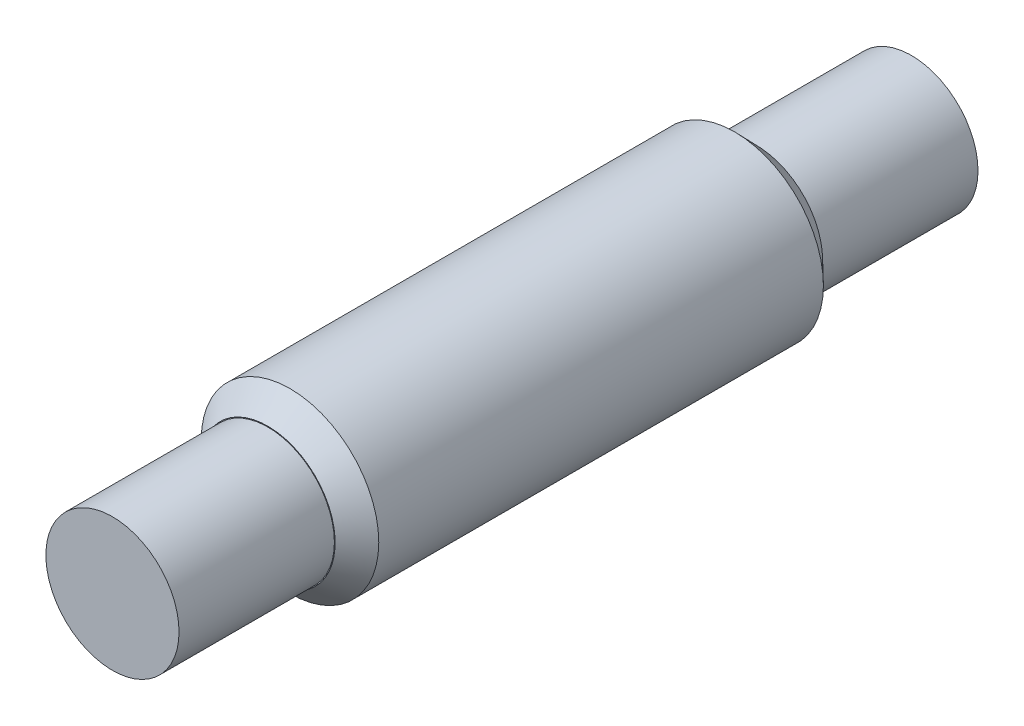
ISO-10303-21;
HEADER;
FILE_DESCRIPTION(('STEP AP214'),'2;1');
FILE_NAME('part.step','',(''),(''),'','','');
FILE_SCHEMA(('AUTOMOTIVE_DESIGN { 1 0 10303 214 1 1 1 1 }'));
ENDSEC;
DATA;
#1=APPLICATION_CONTEXT('core data for automotive mechanical design processes');
#2=APPLICATION_PROTOCOL_DEFINITION('international standard','automotive_design',2000,#1);
#3=PRODUCT_CONTEXT('',#1,'mechanical');
#4=PRODUCT('Part','Part','',(#3));
#5=PRODUCT_RELATED_PRODUCT_CATEGORY('part','',(#4));
#6=PRODUCT_DEFINITION_FORMATION('','',#4);
#7=PRODUCT_DEFINITION_CONTEXT('part definition',#1,'design');
#8=PRODUCT_DEFINITION('design','',#6,#7);
#9=PRODUCT_DEFINITION_SHAPE('','',#8);
#10=(LENGTH_UNIT() NAMED_UNIT(*) SI_UNIT(.MILLI.,.METRE.));
#11=(NAMED_UNIT(*) PLANE_ANGLE_UNIT() SI_UNIT($,.RADIAN.));
#12=(NAMED_UNIT(*) SI_UNIT($,.STERADIAN.) SOLID_ANGLE_UNIT());
#13=UNCERTAINTY_MEASURE_WITH_UNIT(LENGTH_MEASURE(1.E-05),#10,'distance_accuracy_value','');
#14=(GEOMETRIC_REPRESENTATION_CONTEXT(3) GLOBAL_UNCERTAINTY_ASSIGNED_CONTEXT((#13)) GLOBAL_UNIT_ASSIGNED_CONTEXT((#10,
#11,#12)) REPRESENTATION_CONTEXT('',''));
#15=CARTESIAN_POINT('',(0.,0.,0.));
#16=DIRECTION('',(0.,0.,1.));
#17=DIRECTION('',(1.,0.,0.));
#18=AXIS2_PLACEMENT_3D('',#15,#16,#17);
#19=CARTESIAN_POINT('',(0.,0.,9.));
#20=DIRECTION('',(0.,0.,-1.));
#21=DIRECTION('',(-1.,0.,0.));
#22=AXIS2_PLACEMENT_3D('',#19,#20,#21);
#23=PLANE('',#22);
#24=CARTESIAN_POINT('',(0.,0.,9.));
#25=DIRECTION('',(0.,0.,1.));
#26=DIRECTION('',(1.,0.,0.));
#27=AXIS2_PLACEMENT_3D('',#24,#25,#26);
#28=CIRCLE('',#27,1.5);
#29=CARTESIAN_POINT('',(1.5,0.,9.));
#30=VERTEX_POINT('',#29);
#31=EDGE_CURVE('E53',#30,#30,#28,.T.);
#32=ORIENTED_EDGE('',*,*,#31,.T.);
#33=EDGE_LOOP('',(#32));
#34=FACE_BOUND('',#33,.T.);
#35=ADVANCED_FACE('F37',(#34),#23,.F.);
#36=CARTESIAN_POINT('',(0.,0.,9.));
#37=DIRECTION('',(0.,0.,1.));
#38=DIRECTION('',(1.,0.,0.));
#39=AXIS2_PLACEMENT_3D('',#36,#37,#38);
#40=CYLINDRICAL_SURFACE('',#39,1.5);
#41=ORIENTED_EDGE('',*,*,#31,.F.);
#42=EDGE_LOOP('',(#41));
#43=FACE_BOUND('',#42,.T.);
#44=CARTESIAN_POINT('',(0.,0.,5.5));
#45=DIRECTION('',(0.,0.,1.));
#46=DIRECTION('',(1.,0.,0.));
#47=AXIS2_PLACEMENT_3D('',#44,#45,#46);
#48=CIRCLE('',#47,1.5);
#49=CARTESIAN_POINT('',(1.5,0.,5.5));
#50=VERTEX_POINT('',#49);
#51=EDGE_CURVE('E58',#50,#50,#48,.T.);
#52=ORIENTED_EDGE('',*,*,#51,.T.);
#53=EDGE_LOOP('',(#52));
#54=FACE_BOUND('',#53,.T.);
#55=ADVANCED_FACE('F83',(#43,#54),#40,.T.);
#56=CARTESIAN_POINT('',(0.,1.5,5.5));
#57=DIRECTION('',(0.,0.,-1.));
#58=DIRECTION('',(-1.,0.,0.));
#59=AXIS2_PLACEMENT_3D('',#56,#57,#58);
#60=PLANE('',#59);
#61=CARTESIAN_POINT('',(0.,0.,5.5));
#62=DIRECTION('',(0.,0.,-1.));
#63=DIRECTION('',(-1.,0.,0.));
#64=AXIS2_PLACEMENT_3D('',#61,#62,#63);
#65=CIRCLE('',#64,1.51715561259646);
#66=CARTESIAN_POINT('',(-1.51715561259646,0.,5.5));
#67=VERTEX_POINT('',#66);
#68=EDGE_CURVE('E10',#67,#67,#65,.F.);
#69=ORIENTED_EDGE('',*,*,#68,.T.);
#70=EDGE_LOOP('',(#69));
#71=FACE_BOUND('',#70,.T.);
#72=ORIENTED_EDGE('',*,*,#51,.F.);
#73=EDGE_LOOP('',(#72));
#74=FACE_BOUND('',#73,.T.);
#75=ADVANCED_FACE('F89',(#71,#74),#60,.F.);
#76=CARTESIAN_POINT('',(0.,0.,9.));
#77=DIRECTION('',(0.,0.,1.));
#78=DIRECTION('',(1.,0.,0.));
#79=AXIS2_PLACEMENT_3D('',#76,#77,#78);
#80=CYLINDRICAL_SURFACE('',#79,2.);
#81=CARTESIAN_POINT('',(0.,0.,-5.01715561259646));
#82=DIRECTION('',(0.,0.,1.));
#83=DIRECTION('',(1.,0.,0.));
#84=AXIS2_PLACEMENT_3D('',#81,#82,#83);
#85=CIRCLE('',#84,2.);
#86=CARTESIAN_POINT('',(2.,0.,-5.01715561259646));
#87=VERTEX_POINT('',#86);
#88=EDGE_CURVE('E45',#87,#87,#85,.T.);
#89=ORIENTED_EDGE('',*,*,#88,.T.);
#90=EDGE_LOOP('',(#89));
#91=FACE_BOUND('',#90,.T.);
#92=CARTESIAN_POINT('',(0.,0.,5.));
#93=DIRECTION('',(0.,0.,-1.));
#94=DIRECTION('',(-1.,0.,0.));
#95=AXIS2_PLACEMENT_3D('',#92,#93,#94);
#96=CIRCLE('',#95,2.);
#97=CARTESIAN_POINT('',(-2.,0.,5.));
#98=VERTEX_POINT('',#97);
#99=EDGE_CURVE('E49',#98,#98,#96,.T.);
#100=ORIENTED_EDGE('',*,*,#99,.T.);
#101=EDGE_LOOP('',(#100));
#102=FACE_BOUND('',#101,.T.);
#103=ADVANCED_FACE('F79',(#91,#102),#80,.T.);
#104=CARTESIAN_POINT('',(0.,0.,9.));
#105=DIRECTION('',(0.,0.,1.));
#106=DIRECTION('',(1.,0.,0.));
#107=AXIS2_PLACEMENT_3D('',#104,#105,#106);
#108=CYLINDRICAL_SURFACE('',#107,1.5);
#109=CARTESIAN_POINT('',(0.,0.,-5.5));
#110=DIRECTION('',(0.,0.,1.));
#111=DIRECTION('',(1.,0.,0.));
#112=AXIS2_PLACEMENT_3D('',#109,#110,#111);
#113=CIRCLE('',#112,1.5);
#114=CARTESIAN_POINT('',(1.5,0.,-5.5));
#115=VERTEX_POINT('',#114);
#116=EDGE_CURVE('E61',#115,#115,#113,.T.);
#117=ORIENTED_EDGE('',*,*,#116,.F.);
#118=EDGE_LOOP('',(#117));
#119=FACE_BOUND('',#118,.T.);
#120=CARTESIAN_POINT('',(0.,0.,-9.));
#121=DIRECTION('',(0.,0.,1.));
#122=DIRECTION('',(1.,0.,0.));
#123=AXIS2_PLACEMENT_3D('',#120,#121,#122);
#124=CIRCLE('',#123,1.5);
#125=CARTESIAN_POINT('',(1.5,0.,-9.));
#126=VERTEX_POINT('',#125);
#127=EDGE_CURVE('E64',#126,#126,#124,.T.);
#128=ORIENTED_EDGE('',*,*,#127,.T.);
#129=EDGE_LOOP('',(#128));
#130=FACE_BOUND('',#129,.T.);
#131=ADVANCED_FACE('F68',(#119,#130),#108,.T.);
#132=CARTESIAN_POINT('',(0.,0.,-9.));
#133=DIRECTION('',(0.,0.,1.));
#134=DIRECTION('',(1.,0.,0.));
#135=AXIS2_PLACEMENT_3D('',#132,#133,#134);
#136=PLANE('',#135);
#137=ORIENTED_EDGE('',*,*,#127,.F.);
#138=EDGE_LOOP('',(#137));
#139=FACE_BOUND('',#138,.T.);
#140=ADVANCED_FACE('F70',(#139),#136,.F.);
#141=CARTESIAN_POINT('',(0.,0.,-5.01715561259646));
#142=DIRECTION('',(0.,0.,1.));
#143=DIRECTION('',(1.,0.,0.));
#144=AXIS2_PLACEMENT_3D('',#141,#142,#143);
#145=CONICAL_SURFACE('',#144,2.,0.802851455917395);
#146=ORIENTED_EDGE('',*,*,#116,.T.);
#147=EDGE_LOOP('',(#146));
#148=FACE_BOUND('',#147,.T.);
#149=ORIENTED_EDGE('',*,*,#88,.F.);
#150=EDGE_LOOP('',(#149));
#151=FACE_BOUND('',#150,.T.);
#152=ADVANCED_FACE('F72',(#148,#151),#145,.T.);
#153=CARTESIAN_POINT('',(0.,0.,5.5));
#154=DIRECTION('',(0.,0.,-1.));
#155=DIRECTION('',(-1.,0.,0.));
#156=AXIS2_PLACEMENT_3D('',#153,#154,#155);
#157=CONICAL_SURFACE('',#156,1.51715561259646,0.767944870877504);
#158=ORIENTED_EDGE('',*,*,#99,.F.);
#159=EDGE_LOOP('',(#158));
#160=FACE_BOUND('',#159,.T.);
#161=ORIENTED_EDGE('',*,*,#68,.F.);
#162=EDGE_LOOP('',(#161));
#163=FACE_BOUND('',#162,.T.);
#164=ADVANCED_FACE('F40',(#160,#163),#157,.T.);
#165=CLOSED_SHELL('',(#35,#55,#75,#103,#131,#140,#152,#164));
#166=MANIFOLD_SOLID_BREP('B2',#165);
#167=ADVANCED_BREP_SHAPE_REPRESENTATION('',(#18,#166),#14);
#168=SHAPE_DEFINITION_REPRESENTATION(#9,#167);
ENDSEC;
END-ISO-10303-21;
